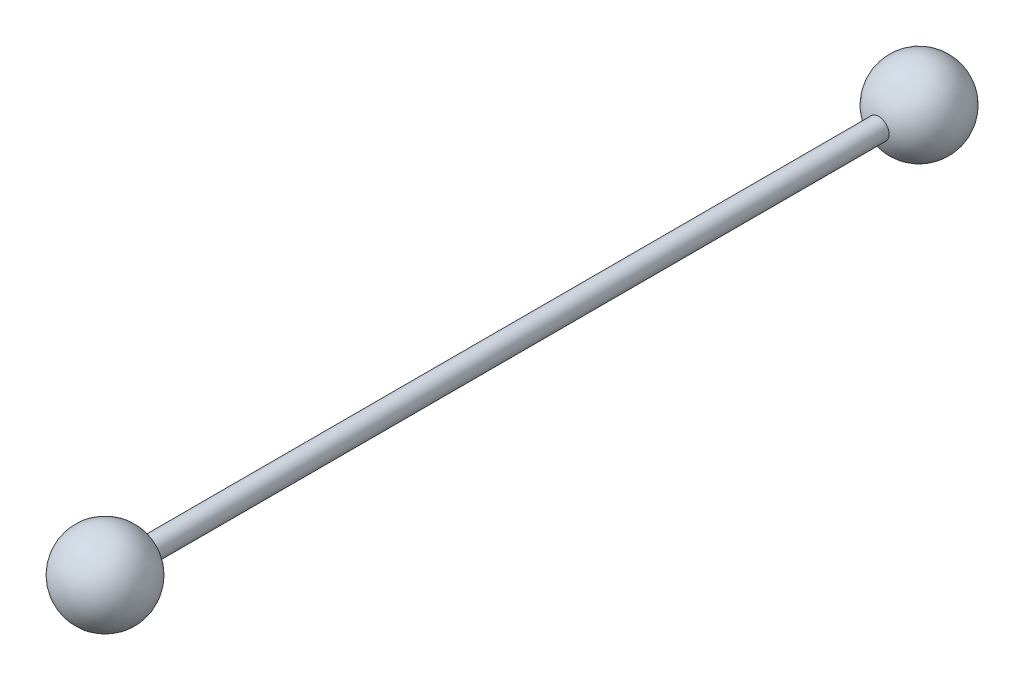
ISO-10303-21;
HEADER;
FILE_DESCRIPTION(('STEP AP214'),'2;1');
FILE_NAME('part.step','',(''),(''),'','','');
FILE_SCHEMA(('AUTOMOTIVE_DESIGN { 1 0 10303 214 1 1 1 1 }'));
ENDSEC;
DATA;
#1=APPLICATION_CONTEXT('core data for automotive mechanical design processes');
#2=APPLICATION_PROTOCOL_DEFINITION('international standard','automotive_design',2000,#1);
#3=PRODUCT_CONTEXT('',#1,'mechanical');
#4=PRODUCT('Part','Part','',(#3));
#5=PRODUCT_RELATED_PRODUCT_CATEGORY('part','',(#4));
#6=PRODUCT_DEFINITION_FORMATION('','',#4);
#7=PRODUCT_DEFINITION_CONTEXT('part definition',#1,'design');
#8=PRODUCT_DEFINITION('design','',#6,#7);
#9=PRODUCT_DEFINITION_SHAPE('','',#8);
#10=(LENGTH_UNIT() NAMED_UNIT(*) SI_UNIT(.MILLI.,.METRE.));
#11=(NAMED_UNIT(*) PLANE_ANGLE_UNIT() SI_UNIT($,.RADIAN.));
#12=(NAMED_UNIT(*) SI_UNIT($,.STERADIAN.) SOLID_ANGLE_UNIT());
#13=UNCERTAINTY_MEASURE_WITH_UNIT(LENGTH_MEASURE(1.E-05),#10,'distance_accuracy_value','');
#14=(GEOMETRIC_REPRESENTATION_CONTEXT(3) GLOBAL_UNCERTAINTY_ASSIGNED_CONTEXT((#13)) GLOBAL_UNIT_ASSIGNED_CONTEXT((#10,
#11,#12)) REPRESENTATION_CONTEXT('',''));
#15=CARTESIAN_POINT('',(0.,0.,0.));
#16=DIRECTION('',(0.,0.,1.));
#17=DIRECTION('',(1.,0.,0.));
#18=AXIS2_PLACEMENT_3D('',#15,#16,#17);
#19=CARTESIAN_POINT('',(-3.04635761589405,-5.36423841059603,390.));
#20=DIRECTION('',(0.,1.,0.));
#21=DIRECTION('',(1.,0.,0.));
#22=AXIS2_PLACEMENT_3D('',#19,#20,#21);
#23=SPHERICAL_SURFACE('',#22,20.);
#24=CARTESIAN_POINT('',(-3.04635761589405,14.635761589404,390.));
#25=VERTEX_POINT('',#24);
#26=VERTEX_LOOP('',#25);
#27=FACE_BOUND('',#26,.T.);
#28=ADVANCED_FACE('F42',(#27),#23,.T.);
#29=CLOSED_SHELL('',(#28));
#30=CARTESIAN_POINT('',(-3.04635761589406,-5.36423841059603,390.));
#31=DIRECTION('',(0.,1.,0.));
#32=DIRECTION('',(1.,0.,0.));
#33=AXIS2_PLACEMENT_3D('',#30,#31,#32);
#34=SPHERICAL_SURFACE('',#33,16.);
#35=CARTESIAN_POINT('',(-3.04635761589406,10.635761589404,390.));
#36=VERTEX_POINT('',#35);
#37=VERTEX_LOOP('',#36);
#38=FACE_BOUND('',#37,.T.);
#39=ADVANCED_FACE('F55',(#38),#34,.F.);
#40=CLOSED_SHELL('',(#39));
#41=ORIENTED_CLOSED_SHELL('',*,#40,.T.);
#42=BREP_WITH_VOIDS('B2',#29,(#41));
#43=CARTESIAN_POINT('',(-3.04635761589404,-5.36423841059603,0.));
#44=DIRECTION('',(0.,1.,0.));
#45=DIRECTION('',(1.,0.,0.));
#46=AXIS2_PLACEMENT_3D('',#43,#44,#45);
#47=SPHERICAL_SURFACE('',#46,20.);
#48=CARTESIAN_POINT('',(-3.04635761589404,-5.36423841059603,0.));
#49=DIRECTION('',(0.,0.,-1.));
#50=DIRECTION('',(-1.,0.,0.));
#51=AXIS2_PLACEMENT_3D('',#48,#49,#50);
#52=SPHERICAL_SURFACE('',#51,20.);
#53=CARTESIAN_POINT('',(-3.04635761589404,-5.36423841059603,19.3649167310371));
#54=DIRECTION('',(0.,0.,-1.));
#55=DIRECTION('',(-1.,0.,0.));
#56=AXIS2_PLACEMENT_3D('',#53,#54,#55);
#57=CIRCLE('',#56,5.);
#58=CARTESIAN_POINT('',(-8.04635761589404,-5.36423841059603,19.3649167310371));
#59=VERTEX_POINT('',#58);
#60=EDGE_CURVE('E70',#59,#59,#57,.T.);
#61=ORIENTED_EDGE('',*,*,#60,.T.);
#62=EDGE_LOOP('',(#61));
#63=FACE_BOUND('',#62,.T.);
#64=ADVANCED_FACE('F67',(#63),#52,.T.);
#65=CARTESIAN_POINT('',(-3.04635761589404,-5.36423841059603,16.));
#66=DIRECTION('',(0.,0.,1.));
#67=DIRECTION('',(1.,0.,0.));
#68=AXIS2_PLACEMENT_3D('',#65,#66,#67);
#69=CYLINDRICAL_SURFACE('',#68,5.);
#70=ORIENTED_EDGE('',*,*,#60,.F.);
#71=EDGE_LOOP('',(#70));
#72=FACE_BOUND('',#71,.T.);
#73=CARTESIAN_POINT('',(-3.04635761589404,-5.36423841059603,374.));
#74=DIRECTION('',(0.,0.,1.));
#75=DIRECTION('',(1.,0.,0.));
#76=AXIS2_PLACEMENT_3D('',#73,#74,#75);
#77=CIRCLE('',#76,5.);
#78=CARTESIAN_POINT('',(1.95364238410596,-5.36423841059603,374.));
#79=VERTEX_POINT('',#78);
#80=EDGE_CURVE('E78',#79,#79,#77,.T.);
#81=ORIENTED_EDGE('',*,*,#80,.F.);
#82=EDGE_LOOP('',(#81));
#83=FACE_BOUND('',#82,.T.);
#84=ADVANCED_FACE('F91',(#72,#83),#69,.T.);
#85=CARTESIAN_POINT('',(-3.04635761589404,-5.36423841059603,374.));
#86=DIRECTION('',(0.,0.,1.));
#87=DIRECTION('',(1.,0.,0.));
#88=AXIS2_PLACEMENT_3D('',#85,#86,#87);
#89=PLANE('',#88);
#90=ORIENTED_EDGE('',*,*,#80,.T.);
#91=EDGE_LOOP('',(#90));
#92=FACE_BOUND('',#91,.T.);
#93=CARTESIAN_POINT('',(-3.04635761589404,-5.36423841059603,374.));
#94=DIRECTION('',(0.,0.,1.));
#95=DIRECTION('',(1.,0.,0.));
#96=AXIS2_PLACEMENT_3D('',#93,#94,#95);
#97=CIRCLE('',#96,3.5);
#98=CARTESIAN_POINT('',(0.453642384105956,-5.36423841059603,374.));
#99=VERTEX_POINT('',#98);
#100=EDGE_CURVE('E82',#99,#99,#97,.T.);
#101=ORIENTED_EDGE('',*,*,#100,.F.);
#102=EDGE_LOOP('',(#101));
#103=FACE_BOUND('',#102,.T.);
#104=ADVANCED_FACE('F88',(#92,#103),#89,.T.);
#105=CARTESIAN_POINT('',(-3.04635761589404,-5.36423841059603,0.));
#106=DIRECTION('',(0.,0.,-1.));
#107=DIRECTION('',(-1.,0.,0.));
#108=AXIS2_PLACEMENT_3D('',#105,#106,#107);
#109=SPHERICAL_SURFACE('',#108,20.);
#110=CARTESIAN_POINT('',(-3.04635761589404,-5.36423841059603,19.6913686675152));
#111=DIRECTION('',(0.,0.,-1.));
#112=DIRECTION('',(-1.,0.,0.));
#113=AXIS2_PLACEMENT_3D('',#110,#111,#112);
#114=CIRCLE('',#113,3.5);
#115=CARTESIAN_POINT('',(-6.54635761589404,-5.36423841059603,19.6913686675152));
#116=VERTEX_POINT('',#115);
#117=EDGE_CURVE('E40',#116,#116,#114,.T.);
#118=ORIENTED_EDGE('',*,*,#117,.F.);
#119=EDGE_LOOP('',(#118));
#120=FACE_BOUND('',#119,.T.);
#121=ADVANCED_FACE('F90',(#120),#109,.T.);
#122=CARTESIAN_POINT('',(-3.04635761589404,-5.36423841059603,16.));
#123=DIRECTION('',(0.,0.,1.));
#124=DIRECTION('',(1.,0.,0.));
#125=AXIS2_PLACEMENT_3D('',#122,#123,#124);
#126=CYLINDRICAL_SURFACE('',#125,3.5);
#127=ORIENTED_EDGE('',*,*,#117,.T.);
#128=EDGE_LOOP('',(#127));
#129=FACE_BOUND('',#128,.T.);
#130=ORIENTED_EDGE('',*,*,#100,.T.);
#131=EDGE_LOOP('',(#130));
#132=FACE_BOUND('',#131,.T.);
#133=ADVANCED_FACE('F86',(#129,#132),#126,.F.);
#134=CLOSED_SHELL('',(#64,#84,#104,#121,#133));
#135=CARTESIAN_POINT('',(-3.04635761589402,-5.36423841059603,0.));
#136=DIRECTION('',(0.,1.,0.));
#137=DIRECTION('',(-1.,0.,0.));
#138=AXIS2_PLACEMENT_3D('',#135,#136,#137);
#139=SPHERICAL_SURFACE('',#138,16.);
#140=CARTESIAN_POINT('',(-3.04635761589402,10.635761589404,0.));
#141=VERTEX_POINT('',#140);
#142=VERTEX_LOOP('',#141);
#143=FACE_BOUND('',#142,.T.);
#144=ADVANCED_FACE('F136',(#143),#139,.F.);
#145=CLOSED_SHELL('',(#144));
#146=ORIENTED_CLOSED_SHELL('',*,#145,.T.);
#147=BREP_WITH_VOIDS('B6',#134,(#146));
#148=ADVANCED_BREP_SHAPE_REPRESENTATION('',(#18,#42,#147),#14);
#149=SHAPE_DEFINITION_REPRESENTATION(#9,#148);
ENDSEC;
END-ISO-10303-21;
